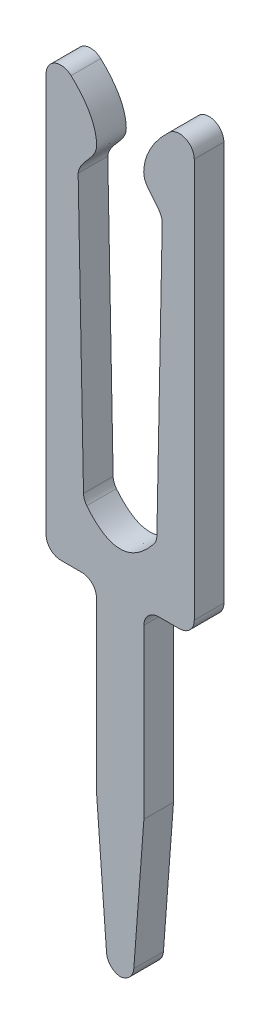
ISO-10303-21;
HEADER;
FILE_DESCRIPTION(('STEP AP214'),'2;1');
FILE_NAME('part.step','',(''),(''),'','','');
FILE_SCHEMA(('AUTOMOTIVE_DESIGN { 1 0 10303 214 1 1 1 1 }'));
ENDSEC;
DATA;
#1=APPLICATION_CONTEXT('core data for automotive mechanical design processes');
#2=APPLICATION_PROTOCOL_DEFINITION('international standard','automotive_design',2000,#1);
#3=PRODUCT_CONTEXT('',#1,'mechanical');
#4=PRODUCT('Part','Part','',(#3));
#5=PRODUCT_RELATED_PRODUCT_CATEGORY('part','',(#4));
#6=PRODUCT_DEFINITION_FORMATION('','',#4);
#7=PRODUCT_DEFINITION_CONTEXT('part definition',#1,'design');
#8=PRODUCT_DEFINITION('design','',#6,#7);
#9=PRODUCT_DEFINITION_SHAPE('','',#8);
#10=(LENGTH_UNIT() NAMED_UNIT(*) SI_UNIT(.MILLI.,.METRE.));
#11=(NAMED_UNIT(*) PLANE_ANGLE_UNIT() SI_UNIT($,.RADIAN.));
#12=(NAMED_UNIT(*) SI_UNIT($,.STERADIAN.) SOLID_ANGLE_UNIT());
#13=UNCERTAINTY_MEASURE_WITH_UNIT(LENGTH_MEASURE(1.E-05),#10,'distance_accuracy_value','');
#14=(GEOMETRIC_REPRESENTATION_CONTEXT(3) GLOBAL_UNCERTAINTY_ASSIGNED_CONTEXT((#13)) GLOBAL_UNIT_ASSIGNED_CONTEXT((#10,
#11,#12)) REPRESENTATION_CONTEXT('',''));
#15=CARTESIAN_POINT('',(0.,0.,0.));
#16=DIRECTION('',(0.,0.,1.));
#17=DIRECTION('',(1.,0.,0.));
#18=AXIS2_PLACEMENT_3D('',#15,#16,#17);
#19=CARTESIAN_POINT('',(0.0155617112013381,0.199393663752104,-0.2));
#20=DIRECTION('',(0.,0.,1.));
#21=DIRECTION('',(1.,0.,0.));
#22=AXIS2_PLACEMENT_3D('',#19,#20,#21);
#23=CYLINDRICAL_SURFACE('',#22,0.200000000000002);
#24=CARTESIAN_POINT('',(0.0155617112013381,0.199393663752104,0.2));
#25=DIRECTION('',(0.,0.,1.));
#26=DIRECTION('',(-1.,0.,0.));
#27=AXIS2_PLACEMENT_3D('',#24,#25,#26);
#28=CIRCLE('',#27,0.200000000000002);
#29=CARTESIAN_POINT('',(-0.183878150776376,0.184435674104075,0.2));
#30=VERTEX_POINT('',#29);
#31=CARTESIAN_POINT('',(0.,0.,0.2));
#32=VERTEX_POINT('',#31);
#33=EDGE_CURVE('E220',#30,#32,#28,.T.);
#34=ORIENTED_EDGE('',*,*,#33,.F.);
#35=DIRECTION('',(0.,0.,1.));
#36=VECTOR('',#35,1.);
#37=CARTESIAN_POINT('',(-0.183878150776376,0.184435674104075,-0.2));
#38=LINE('',#37,#36);
#39=CARTESIAN_POINT('',(-0.183878150776376,0.184435674104075,-0.2));
#40=VERTEX_POINT('',#39);
#41=EDGE_CURVE('E11',#40,#30,#38,.T.);
#42=ORIENTED_EDGE('',*,*,#41,.F.);
#43=CARTESIAN_POINT('',(0.0155617112013381,0.199393663752104,-0.2));
#44=DIRECTION('',(0.,0.,1.));
#45=DIRECTION('',(-1.,0.,0.));
#46=AXIS2_PLACEMENT_3D('',#43,#44,#45);
#47=CIRCLE('',#46,0.200000000000002);
#48=CARTESIAN_POINT('',(0.,0.,-0.2));
#49=VERTEX_POINT('',#48);
#50=EDGE_CURVE('E300',#40,#49,#47,.T.);
#51=ORIENTED_EDGE('',*,*,#50,.T.);
#52=DIRECTION('',(0.,0.,1.));
#53=VECTOR('',#52,1.);
#54=CARTESIAN_POINT('',(0.,0.,-0.2));
#55=LINE('',#54,#53);
#56=EDGE_CURVE('E36',#49,#32,#55,.T.);
#57=ORIENTED_EDGE('',*,*,#56,.T.);
#58=EDGE_LOOP('',(#34,#42,#51,#57));
#59=FACE_BOUND('',#58,.T.);
#60=ADVANCED_FACE('F33',(#59),#23,.T.);
#61=CARTESIAN_POINT('',(-0.183878150776376,0.184435674104075,-0.2));
#62=DIRECTION('',(-0.997199309888568,-0.0747899482401498,0.));
#63=DIRECTION('',(0.0747899482401498,-0.997199309888568,0.));
#64=AXIS2_PLACEMENT_3D('',#61,#62,#63);
#65=PLANE('',#64);
#66=DIRECTION('',(0.0747899482401498,-0.997199309888568,0.));
#67=VECTOR('',#66,1.);
#68=CARTESIAN_POINT('',(-0.183878150776376,0.184435674104075,0.2));
#69=LINE('',#68,#67);
#70=CARTESIAN_POINT('',(-0.319999999997295,1.99939366375255,0.2));
#71=VERTEX_POINT('',#70);
#72=EDGE_CURVE('E298',#71,#30,#69,.T.);
#73=ORIENTED_EDGE('',*,*,#72,.F.);
#74=DIRECTION('',(0.,0.,1.));
#75=VECTOR('',#74,1.);
#76=CARTESIAN_POINT('',(-0.319999999997295,1.99939366375255,-0.2));
#77=LINE('',#76,#75);
#78=CARTESIAN_POINT('',(-0.319999999997295,1.99939366375255,-0.2));
#79=VERTEX_POINT('',#78);
#80=EDGE_CURVE('E42',#79,#71,#77,.T.);
#81=ORIENTED_EDGE('',*,*,#80,.F.);
#82=DIRECTION('',(0.0747899482401498,-0.997199309888568,0.));
#83=VECTOR('',#82,1.);
#84=CARTESIAN_POINT('',(-0.183878150776376,0.184435674104075,-0.2));
#85=LINE('',#84,#83);
#86=EDGE_CURVE('E210',#79,#40,#85,.T.);
#87=ORIENTED_EDGE('',*,*,#86,.T.);
#88=ORIENTED_EDGE('',*,*,#41,.T.);
#89=EDGE_LOOP('',(#73,#81,#87,#88));
#90=FACE_BOUND('',#89,.T.);
#91=ADVANCED_FACE('F342',(#90),#65,.T.);
#92=CARTESIAN_POINT('',(-0.319999999997295,1.99939366375255,-0.2));
#93=DIRECTION('',(-1.,0.,0.));
#94=DIRECTION('',(0.,0.,1.));
#95=AXIS2_PLACEMENT_3D('',#92,#93,#94);
#96=PLANE('',#95);
#97=DIRECTION('',(0.,-1.,0.));
#98=VECTOR('',#97,1.);
#99=CARTESIAN_POINT('',(-0.319999999997295,1.99939366375255,0.2));
#100=LINE('',#99,#98);
#101=CARTESIAN_POINT('',(-0.319999999997295,4.26677514790499,0.2));
#102=VERTEX_POINT('',#101);
#103=EDGE_CURVE('E197',#102,#71,#100,.T.);
#104=ORIENTED_EDGE('',*,*,#103,.F.);
#105=DIRECTION('',(0.,0.,1.));
#106=VECTOR('',#105,1.);
#107=CARTESIAN_POINT('',(-0.319999999997295,4.26677514790499,-0.2));
#108=LINE('',#107,#106);
#109=CARTESIAN_POINT('',(-0.319999999997295,4.26677514790499,-0.2));
#110=VERTEX_POINT('',#109);
#111=EDGE_CURVE('E192',#110,#102,#108,.T.);
#112=ORIENTED_EDGE('',*,*,#111,.F.);
#113=DIRECTION('',(0.,-1.,0.));
#114=VECTOR('',#113,1.);
#115=CARTESIAN_POINT('',(-0.319999999997295,1.99939366375255,-0.2));
#116=LINE('',#115,#114);
#117=EDGE_CURVE('E195',#110,#79,#116,.T.);
#118=ORIENTED_EDGE('',*,*,#117,.T.);
#119=ORIENTED_EDGE('',*,*,#80,.T.);
#120=EDGE_LOOP('',(#104,#112,#118,#119));
#121=FACE_BOUND('',#120,.T.);
#122=ADVANCED_FACE('F194',(#121),#96,.T.);
#123=CARTESIAN_POINT('',(-0.519999999997274,4.26677514790499,-0.2));
#124=DIRECTION('',(0.,0.,1.));
#125=DIRECTION('',(1.,0.,0.));
#126=AXIS2_PLACEMENT_3D('',#123,#124,#125);
#127=CYLINDRICAL_SURFACE('',#126,0.199999999999987);
#128=CARTESIAN_POINT('',(-0.519999999997274,4.26677514790499,0.2));
#129=DIRECTION('',(0.,0.,-1.));
#130=DIRECTION('',(1.,0.,0.));
#131=AXIS2_PLACEMENT_3D('',#128,#129,#130);
#132=CIRCLE('',#131,0.199999999999987);
#133=CARTESIAN_POINT('',(-0.519999999997275,4.46677514790498,0.2));
#134=VERTEX_POINT('',#133);
#135=EDGE_CURVE('E295',#134,#102,#132,.T.);
#136=ORIENTED_EDGE('',*,*,#135,.F.);
#137=DIRECTION('',(0.,0.,1.));
#138=VECTOR('',#137,1.);
#139=CARTESIAN_POINT('',(-0.519999999997275,4.46677514790498,-0.2));
#140=LINE('',#139,#138);
#141=CARTESIAN_POINT('',(-0.519999999997275,4.46677514790498,-0.2));
#142=VERTEX_POINT('',#141);
#143=EDGE_CURVE('E202',#142,#134,#140,.T.);
#144=ORIENTED_EDGE('',*,*,#143,.F.);
#145=CARTESIAN_POINT('',(-0.519999999997274,4.26677514790499,-0.2));
#146=DIRECTION('',(0.,0.,-1.));
#147=DIRECTION('',(1.,0.,0.));
#148=AXIS2_PLACEMENT_3D('',#145,#146,#147);
#149=CIRCLE('',#148,0.199999999999987);
#150=EDGE_CURVE('E208',#142,#110,#149,.T.);
#151=ORIENTED_EDGE('',*,*,#150,.T.);
#152=ORIENTED_EDGE('',*,*,#111,.T.);
#153=EDGE_LOOP('',(#136,#144,#151,#152));
#154=FACE_BOUND('',#153,.T.);
#155=ADVANCED_FACE('F212',(#154),#127,.F.);
#156=CARTESIAN_POINT('',(-0.519999999997275,4.46677514790498,-0.2));
#157=DIRECTION('',(0.,-1.,0.));
#158=DIRECTION('',(1.,0.,0.));
#159=AXIS2_PLACEMENT_3D('',#156,#157,#158);
#160=PLANE('',#159);
#161=DIRECTION('',(1.,0.,0.));
#162=VECTOR('',#161,1.);
#163=CARTESIAN_POINT('',(-0.519999999997275,4.46677514790498,0.2));
#164=LINE('',#163,#162);
#165=CARTESIAN_POINT('',(-0.799999999997298,4.46677514790498,0.2));
#166=VERTEX_POINT('',#165);
#167=EDGE_CURVE('E292',#166,#134,#164,.T.);
#168=ORIENTED_EDGE('',*,*,#167,.F.);
#169=DIRECTION('',(0.,0.,1.));
#170=VECTOR('',#169,1.);
#171=CARTESIAN_POINT('',(-0.799999999997298,4.46677514790498,-0.2));
#172=LINE('',#171,#170);
#173=CARTESIAN_POINT('',(-0.799999999997298,4.46677514790498,-0.2));
#174=VERTEX_POINT('',#173);
#175=EDGE_CURVE('E304',#174,#166,#172,.T.);
#176=ORIENTED_EDGE('',*,*,#175,.F.);
#177=DIRECTION('',(1.,0.,0.));
#178=VECTOR('',#177,1.);
#179=CARTESIAN_POINT('',(-0.519999999997275,4.46677514790498,-0.2));
#180=LINE('',#179,#178);
#181=EDGE_CURVE('E213',#174,#142,#180,.T.);
#182=ORIENTED_EDGE('',*,*,#181,.T.);
#183=ORIENTED_EDGE('',*,*,#143,.T.);
#184=EDGE_LOOP('',(#168,#176,#182,#183));
#185=FACE_BOUND('',#184,.T.);
#186=ADVANCED_FACE('F355',(#185),#160,.T.);
#187=CARTESIAN_POINT('',(-0.799999999997298,4.66677514790498,-0.2));
#188=DIRECTION('',(0.,0.,1.));
#189=DIRECTION('',(1.,0.,0.));
#190=AXIS2_PLACEMENT_3D('',#187,#188,#189);
#191=CYLINDRICAL_SURFACE('',#190,0.199999999999995);
#192=CARTESIAN_POINT('',(-0.799999999997298,4.66677514790498,0.2));
#193=DIRECTION('',(0.,0.,1.));
#194=DIRECTION('',(-1.,0.,0.));
#195=AXIS2_PLACEMENT_3D('',#192,#193,#194);
#196=CIRCLE('',#195,0.199999999999995);
#197=CARTESIAN_POINT('',(-0.999999999997293,4.66677514790498,0.2));
#198=VERTEX_POINT('',#197);
#199=EDGE_CURVE('E289',#198,#166,#196,.T.);
#200=ORIENTED_EDGE('',*,*,#199,.F.);
#201=DIRECTION('',(0.,0.,1.));
#202=VECTOR('',#201,1.);
#203=CARTESIAN_POINT('',(-0.999999999997293,4.66677514790498,-0.2));
#204=LINE('',#203,#202);
#205=CARTESIAN_POINT('',(-0.999999999997293,4.66677514790498,-0.2));
#206=VERTEX_POINT('',#205);
#207=EDGE_CURVE('E306',#206,#198,#204,.T.);
#208=ORIENTED_EDGE('',*,*,#207,.F.);
#209=CARTESIAN_POINT('',(-0.799999999997298,4.66677514790498,-0.2));
#210=DIRECTION('',(0.,0.,1.));
#211=DIRECTION('',(-1.,0.,0.));
#212=AXIS2_PLACEMENT_3D('',#209,#210,#211);
#213=CIRCLE('',#212,0.199999999999995);
#214=EDGE_CURVE('E215',#206,#174,#213,.T.);
#215=ORIENTED_EDGE('',*,*,#214,.T.);
#216=ORIENTED_EDGE('',*,*,#175,.T.);
#217=EDGE_LOOP('',(#200,#208,#215,#216));
#218=FACE_BOUND('',#217,.T.);
#219=ADVANCED_FACE('F358',(#218),#191,.T.);
#220=CARTESIAN_POINT('',(-0.999999999997296,4.66677514790498,-0.2));
#221=DIRECTION('',(-1.,0.,0.));
#222=DIRECTION('',(0.,-1.,0.));
#223=AXIS2_PLACEMENT_3D('',#220,#221,#222);
#224=PLANE('',#223);
#225=DIRECTION('',(0.,-1.,0.));
#226=VECTOR('',#225,1.);
#227=CARTESIAN_POINT('',(-0.999999999997296,4.66677514790498,0.2));
#228=LINE('',#227,#226);
#229=CARTESIAN_POINT('',(-0.999999999997305,10.0571986848758,0.2));
#230=VERTEX_POINT('',#229);
#231=EDGE_CURVE('E286',#230,#198,#228,.T.);
#232=ORIENTED_EDGE('',*,*,#231,.F.);
#233=DIRECTION('',(0.,0.,1.));
#234=VECTOR('',#233,1.);
#235=CARTESIAN_POINT('',(-0.999999999997305,10.0571986848758,-0.2));
#236=LINE('',#235,#234);
#237=CARTESIAN_POINT('',(-0.999999999997305,10.0571986848758,-0.2));
#238=VERTEX_POINT('',#237);
#239=EDGE_CURVE('E308',#238,#230,#236,.T.);
#240=ORIENTED_EDGE('',*,*,#239,.F.);
#241=DIRECTION('',(0.,-1.,0.));
#242=VECTOR('',#241,1.);
#243=CARTESIAN_POINT('',(-0.999999999997296,4.66677514790498,-0.2));
#244=LINE('',#243,#242);
#245=EDGE_CURVE('E393',#238,#206,#244,.T.);
#246=ORIENTED_EDGE('',*,*,#245,.T.);
#247=ORIENTED_EDGE('',*,*,#207,.T.);
#248=EDGE_LOOP('',(#232,#240,#246,#247));
#249=FACE_BOUND('',#248,.T.);
#250=ADVANCED_FACE('F362',(#249),#224,.T.);
#251=CARTESIAN_POINT('',(-0.799999999997313,10.0571986848758,-0.2));
#252=DIRECTION('',(0.,0.,1.));
#253=DIRECTION('',(1.,0.,0.));
#254=AXIS2_PLACEMENT_3D('',#251,#252,#253);
#255=CYLINDRICAL_SURFACE('',#254,0.199999999999993);
#256=CARTESIAN_POINT('',(-0.799999999997313,10.0571986848758,0.2));
#257=DIRECTION('',(0.,0.,1.));
#258=DIRECTION('',(-1.,0.,0.));
#259=AXIS2_PLACEMENT_3D('',#256,#257,#258);
#260=CIRCLE('',#259,0.199999999999993);
#261=CARTESIAN_POINT('',(-0.663039519004165,10.2029444451782,0.2));
#262=VERTEX_POINT('',#261);
#263=EDGE_CURVE('E280',#262,#230,#260,.T.);
#264=ORIENTED_EDGE('',*,*,#263,.F.);
#265=DIRECTION('',(0.,0.,1.));
#266=VECTOR('',#265,1.);
#267=CARTESIAN_POINT('',(-0.663039519004165,10.2029444451782,-0.2));
#268=LINE('',#267,#266);
#269=CARTESIAN_POINT('',(-0.663039519004165,10.2029444451782,-0.2));
#270=VERTEX_POINT('',#269);
#271=EDGE_CURVE('E310',#270,#262,#268,.T.);
#272=ORIENTED_EDGE('',*,*,#271,.F.);
#273=CARTESIAN_POINT('',(-0.799999999997313,10.0571986848758,-0.2));
#274=DIRECTION('',(0.,0.,1.));
#275=DIRECTION('',(-1.,0.,0.));
#276=AXIS2_PLACEMENT_3D('',#273,#274,#275);
#277=CIRCLE('',#276,0.199999999999993);
#278=EDGE_CURVE('E385',#270,#238,#277,.T.);
#279=ORIENTED_EDGE('',*,*,#278,.T.);
#280=ORIENTED_EDGE('',*,*,#239,.T.);
#281=EDGE_LOOP('',(#264,#272,#279,#280));
#282=FACE_BOUND('',#281,.T.);
#283=ADVANCED_FACE('F366',(#282),#255,.T.);
#284=CARTESIAN_POINT('',(-0.567669207755578,9.10834496937554,-0.2));
#285=CARTESIAN_POINT('',(-0.54845388756171,9.27598469580027,-0.2));
#286=CARTESIAN_POINT('',(-0.310671132232239,9.38824738927317,-0.2));
#287=CARTESIAN_POINT('',(-0.326177603548474,9.81615503897428,-0.2));
#288=CARTESIAN_POINT('',(-0.487599251440383,10.0380793857477,-0.2));
#289=CARTESIAN_POINT('',(-0.663039519004166,10.2029444451782,-0.2));
#290=B_SPLINE_CURVE_WITH_KNOTS('',3,(#284,#285,#286,#287,#288,#289),.UNSPECIFIED.,.F.,.F.,(4,1,
1,4),(0.253308427317744,0.546240991694777,0.590136450844154,1.),.UNSPECIFIED.);
#291=DIRECTION('',(0.,0.,1.));
#292=VECTOR('',#291,1.);
#293=SURFACE_OF_LINEAR_EXTRUSION('',#290,#292);
#294=CARTESIAN_POINT('',(-0.567669207755578,9.10834496937554,0.2));
#295=CARTESIAN_POINT('',(-0.54845388756171,9.27598469580027,0.2));
#296=CARTESIAN_POINT('',(-0.310671132232239,9.38824738927317,0.2));
#297=CARTESIAN_POINT('',(-0.326177603548474,9.81615503897428,0.2));
#298=CARTESIAN_POINT('',(-0.487599251440383,10.0380793857477,0.2));
#299=CARTESIAN_POINT('',(-0.663039519004166,10.2029444451782,0.2));
#300=B_SPLINE_CURVE_WITH_KNOTS('',3,(#294,#295,#296,#297,#298,#299),.UNSPECIFIED.,.F.,.F.,(4,1,
1,4),(0.253308427317744,0.546240991694777,0.590136450844154,1.),.UNSPECIFIED.);
#301=CARTESIAN_POINT('',(-0.567669207755578,9.10834496937554,0.2));
#302=VERTEX_POINT('',#301);
#303=EDGE_CURVE('E275',#302,#262,#300,.T.);
#304=ORIENTED_EDGE('',*,*,#303,.F.);
#305=DIRECTION('',(0.,0.,1.));
#306=VECTOR('',#305,1.);
#307=CARTESIAN_POINT('',(-0.567669207755578,9.10834496937554,-0.2));
#308=LINE('',#307,#306);
#309=CARTESIAN_POINT('',(-0.567669207755578,9.10834496937554,-0.2));
#310=VERTEX_POINT('',#309);
#311=EDGE_CURVE('E312',#310,#302,#308,.T.);
#312=ORIENTED_EDGE('',*,*,#311,.F.);
#313=EDGE_CURVE('E378',#310,#270,#290,.T.);
#314=ORIENTED_EDGE('',*,*,#313,.T.);
#315=ORIENTED_EDGE('',*,*,#271,.T.);
#316=EDGE_LOOP('',(#304,#312,#314,#315));
#317=FACE_BOUND('',#316,.T.);
#318=ADVANCED_FACE('F370',(#317),#293,.T.);
#319=CARTESIAN_POINT('',(-0.567669207755587,9.10834496937554,-0.2));
#320=DIRECTION('',(0.999809016262246,0.0195430550508509,0.));
#321=DIRECTION('',(-0.0195430550508509,0.999809016262246,0.));
#322=AXIS2_PLACEMENT_3D('',#319,#320,#321);
#323=PLANE('',#322);
#324=DIRECTION('',(-0.0195430550508509,0.999809016262246,0.));
#325=VECTOR('',#324,1.);
#326=CARTESIAN_POINT('',(-0.567669207755587,9.10834496937554,0.2));
#327=LINE('',#326,#325);
#328=CARTESIAN_POINT('',(-0.495215905001466,5.40168471778945,0.2));
#329=VERTEX_POINT('',#328);
#330=EDGE_CURVE('E272',#329,#302,#327,.T.);
#331=ORIENTED_EDGE('',*,*,#330,.F.);
#332=DIRECTION('',(0.,0.,1.));
#333=VECTOR('',#332,1.);
#334=CARTESIAN_POINT('',(-0.495215905001466,5.40168471778945,-0.2));
#335=LINE('',#334,#333);
#336=CARTESIAN_POINT('',(-0.495215905001466,5.40168471778945,-0.2));
#337=VERTEX_POINT('',#336);
#338=EDGE_CURVE('E314',#337,#329,#335,.T.);
#339=ORIENTED_EDGE('',*,*,#338,.F.);
#340=DIRECTION('',(-0.0195430550508509,0.999809016262246,0.));
#341=VECTOR('',#340,1.);
#342=CARTESIAN_POINT('',(-0.567669207755587,9.10834496937554,-0.2));
#343=LINE('',#342,#341);
#344=EDGE_CURVE('E386',#337,#310,#343,.T.);
#345=ORIENTED_EDGE('',*,*,#344,.T.);
#346=ORIENTED_EDGE('',*,*,#311,.T.);
#347=EDGE_LOOP('',(#331,#339,#345,#346));
#348=FACE_BOUND('',#347,.T.);
#349=ADVANCED_FACE('F375',(#348),#323,.T.);
#350=CARTESIAN_POINT('',(-0.295254101749009,5.40559332879962,-0.2));
#351=DIRECTION('',(0.,0.,1.));
#352=DIRECTION('',(1.,0.,0.));
#353=AXIS2_PLACEMENT_3D('',#350,#351,#352);
#354=CYLINDRICAL_SURFACE('',#353,0.200000000000006);
#355=CARTESIAN_POINT('',(-0.295254101749009,5.40559332879962,0.2));
#356=DIRECTION('',(0.,0.,-1.));
#357=DIRECTION('',(1.,0.,0.));
#358=AXIS2_PLACEMENT_3D('',#355,#356,#357);
#359=CIRCLE('',#358,0.200000000000006);
#360=CARTESIAN_POINT('',(-0.451053838511064,5.28018821716187,0.2));
#361=VERTEX_POINT('',#360);
#362=EDGE_CURVE('E266',#361,#329,#359,.T.);
#363=ORIENTED_EDGE('',*,*,#362,.F.);
#364=DIRECTION('',(0.,0.,1.));
#365=VECTOR('',#364,1.);
#366=CARTESIAN_POINT('',(-0.451053838511064,5.28018821716187,-0.2));
#367=LINE('',#366,#365);
#368=CARTESIAN_POINT('',(-0.451053838511064,5.28018821716187,-0.2));
#369=VERTEX_POINT('',#368);
#370=EDGE_CURVE('E316',#369,#361,#367,.T.);
#371=ORIENTED_EDGE('',*,*,#370,.F.);
#372=CARTESIAN_POINT('',(-0.295254101749009,5.40559332879962,-0.2));
#373=DIRECTION('',(0.,0.,-1.));
#374=DIRECTION('',(1.,0.,0.));
#375=AXIS2_PLACEMENT_3D('',#372,#373,#374);
#376=CIRCLE('',#375,0.200000000000006);
#377=EDGE_CURVE('E411',#369,#337,#376,.T.);
#378=ORIENTED_EDGE('',*,*,#377,.T.);
#379=ORIENTED_EDGE('',*,*,#338,.T.);
#380=EDGE_LOOP('',(#363,#371,#378,#379));
#381=FACE_BOUND('',#380,.T.);
#382=ADVANCED_FACE('F430',(#381),#354,.F.);
#383=CARTESIAN_POINT('',(0.451053838511063,5.28018821716187,-0.2));
#384=CARTESIAN_POINT('',(0.,4.71981178283813,-0.2));
#385=CARTESIAN_POINT('',(-0.451053838511063,5.28018821716187,-0.2));
#386=B_SPLINE_CURVE_WITH_KNOTS('',2,(#383,#384,#385),.UNSPECIFIED.,.F.,.F.,(3,3),
(0.0434047342329982,0.956595265767001),.UNSPECIFIED.);
#387=DIRECTION('',(0.,0.,1.));
#388=VECTOR('',#387,1.);
#389=SURFACE_OF_LINEAR_EXTRUSION('',#386,#388);
#390=CARTESIAN_POINT('',(0.451053838511063,5.28018821716187,0.2));
#391=CARTESIAN_POINT('',(0.,4.71981178283813,0.2));
#392=CARTESIAN_POINT('',(-0.451053838511063,5.28018821716187,0.2));
#393=B_SPLINE_CURVE_WITH_KNOTS('',2,(#390,#391,#392),.UNSPECIFIED.,.F.,.F.,(3,3),
(0.0434047342329982,0.956595265767001),.UNSPECIFIED.);
#394=CARTESIAN_POINT('',(0.451053838511063,5.28018821716187,0.2));
#395=VERTEX_POINT('',#394);
#396=EDGE_CURVE('E261',#395,#361,#393,.T.);
#397=ORIENTED_EDGE('',*,*,#396,.F.);
#398=DIRECTION('',(0.,0.,1.));
#399=VECTOR('',#398,1.);
#400=CARTESIAN_POINT('',(0.451053838511063,5.28018821716187,-0.2));
#401=LINE('',#400,#399);
#402=CARTESIAN_POINT('',(0.451053838511063,5.28018821716187,-0.2));
#403=VERTEX_POINT('',#402);
#404=EDGE_CURVE('E318',#403,#395,#401,.T.);
#405=ORIENTED_EDGE('',*,*,#404,.F.);
#406=EDGE_CURVE('E412',#403,#369,#386,.T.);
#407=ORIENTED_EDGE('',*,*,#406,.T.);
#408=ORIENTED_EDGE('',*,*,#370,.T.);
#409=EDGE_LOOP('',(#397,#405,#407,#408));
#410=FACE_BOUND('',#409,.T.);
#411=ADVANCED_FACE('F426',(#410),#389,.T.);
#412=CARTESIAN_POINT('',(0.29525410174901,5.40559332879962,-0.2));
#413=DIRECTION('',(0.,0.,1.));
#414=DIRECTION('',(1.,0.,0.));
#415=AXIS2_PLACEMENT_3D('',#412,#413,#414);
#416=CYLINDRICAL_SURFACE('',#415,0.200000000000008);
#417=CARTESIAN_POINT('',(0.29525410174901,5.40559332879962,0.2));
#418=DIRECTION('',(0.,0.,-1.));
#419=DIRECTION('',(-1.,0.,0.));
#420=AXIS2_PLACEMENT_3D('',#417,#418,#419);
#421=CIRCLE('',#420,0.200000000000008);
#422=CARTESIAN_POINT('',(0.495215905001467,5.40168471778945,0.2));
#423=VERTEX_POINT('',#422);
#424=EDGE_CURVE('E258',#423,#395,#421,.T.);
#425=ORIENTED_EDGE('',*,*,#424,.F.);
#426=DIRECTION('',(0.,0.,1.));
#427=VECTOR('',#426,1.);
#428=CARTESIAN_POINT('',(0.495215905001467,5.40168471778945,-0.2));
#429=LINE('',#428,#427);
#430=CARTESIAN_POINT('',(0.495215905001467,5.40168471778945,-0.2));
#431=VERTEX_POINT('',#430);
#432=EDGE_CURVE('E320',#431,#423,#429,.T.);
#433=ORIENTED_EDGE('',*,*,#432,.F.);
#434=CARTESIAN_POINT('',(0.29525410174901,5.40559332879962,-0.2));
#435=DIRECTION('',(0.,0.,-1.));
#436=DIRECTION('',(-1.,0.,0.));
#437=AXIS2_PLACEMENT_3D('',#434,#435,#436);
#438=CIRCLE('',#437,0.200000000000008);
#439=EDGE_CURVE('E415',#431,#403,#438,.T.);
#440=ORIENTED_EDGE('',*,*,#439,.T.);
#441=ORIENTED_EDGE('',*,*,#404,.T.);
#442=EDGE_LOOP('',(#425,#433,#440,#441));
#443=FACE_BOUND('',#442,.T.);
#444=ADVANCED_FACE('F429',(#443),#416,.F.);
#445=CARTESIAN_POINT('',(0.567669207755587,9.10834496937554,-0.2));
#446=DIRECTION('',(-0.999809016262246,0.0195430550508509,0.));
#447=DIRECTION('',(-0.0195430550508509,-0.999809016262246,0.));
#448=AXIS2_PLACEMENT_3D('',#445,#446,#447);
#449=PLANE('',#448);
#450=DIRECTION('',(-0.0195430550508509,-0.999809016262246,0.));
#451=VECTOR('',#450,1.);
#452=CARTESIAN_POINT('',(0.567669207755587,9.10834496937554,0.2));
#453=LINE('',#452,#451);
#454=CARTESIAN_POINT('',(0.567669207755587,9.10834496937554,0.2));
#455=VERTEX_POINT('',#454);
#456=EDGE_CURVE('E252',#455,#423,#453,.T.);
#457=ORIENTED_EDGE('',*,*,#456,.F.);
#458=DIRECTION('',(0.,0.,1.));
#459=VECTOR('',#458,1.);
#460=CARTESIAN_POINT('',(0.567669207755587,9.10834496937554,-0.2));
#461=LINE('',#460,#459);
#462=CARTESIAN_POINT('',(0.567669207755587,9.10834496937554,-0.2));
#463=VERTEX_POINT('',#462);
#464=EDGE_CURVE('E322',#463,#455,#461,.T.);
#465=ORIENTED_EDGE('',*,*,#464,.F.);
#466=DIRECTION('',(-0.0195430550508509,-0.999809016262246,0.));
#467=VECTOR('',#466,1.);
#468=CARTESIAN_POINT('',(0.567669207755587,9.10834496937554,-0.2));
#469=LINE('',#468,#467);
#470=EDGE_CURVE('E452',#463,#431,#469,.T.);
#471=ORIENTED_EDGE('',*,*,#470,.T.);
#472=ORIENTED_EDGE('',*,*,#432,.T.);
#473=EDGE_LOOP('',(#457,#465,#471,#472));
#474=FACE_BOUND('',#473,.T.);
#475=ADVANCED_FACE('F434',(#474),#449,.T.);
#476=CARTESIAN_POINT('',(0.663039519004165,10.2029444451782,-0.2));
#477=CARTESIAN_POINT('',(0.487599251440382,10.0380793857477,-0.2));
#478=CARTESIAN_POINT('',(0.326177603548474,9.81615503897428,-0.2));
#479=CARTESIAN_POINT('',(0.31067113223224,9.38824738927318,-0.2));
#480=CARTESIAN_POINT('',(0.548453887561711,9.27598469580027,-0.2));
#481=CARTESIAN_POINT('',(0.567669207755578,9.10834496937554,-0.2));
#482=B_SPLINE_CURVE_WITH_KNOTS('',3,(#476,#477,#478,#479,#480,#481),.UNSPECIFIED.,.F.,.F.,(4,1,
1,4),(0.253308427317744,0.66317197647359,0.707067435622967,1.),.UNSPECIFIED.);
#483=DIRECTION('',(0.,0.,1.));
#484=VECTOR('',#483,1.);
#485=SURFACE_OF_LINEAR_EXTRUSION('',#482,#484);
#486=CARTESIAN_POINT('',(0.663039519004165,10.2029444451782,0.2));
#487=CARTESIAN_POINT('',(0.487599251440382,10.0380793857477,0.2));
#488=CARTESIAN_POINT('',(0.326177603548474,9.81615503897428,0.2));
#489=CARTESIAN_POINT('',(0.31067113223224,9.38824738927318,0.2));
#490=CARTESIAN_POINT('',(0.548453887561711,9.27598469580027,0.2));
#491=CARTESIAN_POINT('',(0.567669207755578,9.10834496937554,0.2));
#492=B_SPLINE_CURVE_WITH_KNOTS('',3,(#486,#487,#488,#489,#490,#491),.UNSPECIFIED.,.F.,.F.,(4,1,
1,4),(0.253308427317744,0.66317197647359,0.707067435622967,1.),.UNSPECIFIED.);
#493=CARTESIAN_POINT('',(0.663039519004165,10.2029444451782,0.2));
#494=VERTEX_POINT('',#493);
#495=EDGE_CURVE('E247',#494,#455,#492,.T.);
#496=ORIENTED_EDGE('',*,*,#495,.F.);
#497=DIRECTION('',(0.,0.,1.));
#498=VECTOR('',#497,1.);
#499=CARTESIAN_POINT('',(0.663039519004165,10.2029444451782,-0.2));
#500=LINE('',#499,#498);
#501=CARTESIAN_POINT('',(0.663039519004165,10.2029444451782,-0.2));
#502=VERTEX_POINT('',#501);
#503=EDGE_CURVE('E324',#502,#494,#500,.T.);
#504=ORIENTED_EDGE('',*,*,#503,.F.);
#505=EDGE_CURVE('E446',#502,#463,#482,.T.);
#506=ORIENTED_EDGE('',*,*,#505,.T.);
#507=ORIENTED_EDGE('',*,*,#464,.T.);
#508=EDGE_LOOP('',(#496,#504,#506,#507));
#509=FACE_BOUND('',#508,.T.);
#510=ADVANCED_FACE('F438',(#509),#485,.T.);
#511=CARTESIAN_POINT('',(0.799999999997314,10.0571986848758,-0.2));
#512=DIRECTION('',(0.,0.,1.));
#513=DIRECTION('',(1.,0.,0.));
#514=AXIS2_PLACEMENT_3D('',#511,#512,#513);
#515=CYLINDRICAL_SURFACE('',#514,0.199999999999993);
#516=CARTESIAN_POINT('',(0.799999999997314,10.0571986848758,0.2));
#517=DIRECTION('',(0.,0.,1.));
#518=DIRECTION('',(1.,0.,0.));
#519=AXIS2_PLACEMENT_3D('',#516,#517,#518);
#520=CIRCLE('',#519,0.199999999999993);
#521=CARTESIAN_POINT('',(0.999999999997306,10.0571986848758,0.2));
#522=VERTEX_POINT('',#521);
#523=EDGE_CURVE('E244',#522,#494,#520,.T.);
#524=ORIENTED_EDGE('',*,*,#523,.F.);
#525=DIRECTION('',(0.,0.,1.));
#526=VECTOR('',#525,1.);
#527=CARTESIAN_POINT('',(0.999999999997306,10.0571986848758,-0.2));
#528=LINE('',#527,#526);
#529=CARTESIAN_POINT('',(0.999999999997306,10.0571986848758,-0.2));
#530=VERTEX_POINT('',#529);
#531=EDGE_CURVE('E326',#530,#522,#528,.T.);
#532=ORIENTED_EDGE('',*,*,#531,.F.);
#533=CARTESIAN_POINT('',(0.799999999997314,10.0571986848758,-0.2));
#534=DIRECTION('',(0.,0.,1.));
#535=DIRECTION('',(1.,0.,0.));
#536=AXIS2_PLACEMENT_3D('',#533,#534,#535);
#537=CIRCLE('',#536,0.199999999999993);
#538=EDGE_CURVE('E453',#530,#502,#537,.T.);
#539=ORIENTED_EDGE('',*,*,#538,.T.);
#540=ORIENTED_EDGE('',*,*,#503,.T.);
#541=EDGE_LOOP('',(#524,#532,#539,#540));
#542=FACE_BOUND('',#541,.T.);
#543=ADVANCED_FACE('F443',(#542),#515,.T.);
#544=CARTESIAN_POINT('',(0.999999999997298,4.66677514790498,-0.2));
#545=DIRECTION('',(1.,0.,0.));
#546=DIRECTION('',(0.,1.,0.));
#547=AXIS2_PLACEMENT_3D('',#544,#545,#546);
#548=PLANE('',#547);
#549=DIRECTION('',(0.,1.,0.));
#550=VECTOR('',#549,1.);
#551=CARTESIAN_POINT('',(0.999999999997298,4.66677514790498,0.2));
#552=LINE('',#551,#550);
#553=CARTESIAN_POINT('',(0.999999999997298,4.66677514790498,0.2));
#554=VERTEX_POINT('',#553);
#555=EDGE_CURVE('E241',#554,#522,#552,.T.);
#556=ORIENTED_EDGE('',*,*,#555,.F.);
#557=DIRECTION('',(0.,0.,1.));
#558=VECTOR('',#557,1.);
#559=CARTESIAN_POINT('',(0.999999999997298,4.66677514790498,-0.2));
#560=LINE('',#559,#558);
#561=CARTESIAN_POINT('',(0.999999999997298,4.66677514790498,-0.2));
#562=VERTEX_POINT('',#561);
#563=EDGE_CURVE('E328',#562,#554,#560,.T.);
#564=ORIENTED_EDGE('',*,*,#563,.F.);
#565=DIRECTION('',(0.,1.,0.));
#566=VECTOR('',#565,1.);
#567=CARTESIAN_POINT('',(0.999999999997298,4.66677514790498,-0.2));
#568=LINE('',#567,#566);
#569=EDGE_CURVE('E475',#562,#530,#568,.T.);
#570=ORIENTED_EDGE('',*,*,#569,.T.);
#571=ORIENTED_EDGE('',*,*,#531,.T.);
#572=EDGE_LOOP('',(#556,#564,#570,#571));
#573=FACE_BOUND('',#572,.T.);
#574=ADVANCED_FACE('F515',(#573),#548,.T.);
#575=CARTESIAN_POINT('',(0.799999999997299,4.66677514790498,-0.2));
#576=DIRECTION('',(0.,0.,1.));
#577=DIRECTION('',(1.,0.,0.));
#578=AXIS2_PLACEMENT_3D('',#575,#576,#577);
#579=CYLINDRICAL_SURFACE('',#578,0.199999999999995);
#580=CARTESIAN_POINT('',(0.799999999997299,4.66677514790498,0.2));
#581=DIRECTION('',(0.,0.,1.));
#582=DIRECTION('',(1.,0.,0.));
#583=AXIS2_PLACEMENT_3D('',#580,#581,#582);
#584=CIRCLE('',#583,0.199999999999995);
#585=CARTESIAN_POINT('',(0.799999999997299,4.46677514790498,0.2));
#586=VERTEX_POINT('',#585);
#587=EDGE_CURVE('E238',#586,#554,#584,.T.);
#588=ORIENTED_EDGE('',*,*,#587,.F.);
#589=DIRECTION('',(0.,0.,1.));
#590=VECTOR('',#589,1.);
#591=CARTESIAN_POINT('',(0.799999999997299,4.46677514790498,-0.2));
#592=LINE('',#591,#590);
#593=CARTESIAN_POINT('',(0.799999999997299,4.46677514790498,-0.2));
#594=VERTEX_POINT('',#593);
#595=EDGE_CURVE('E330',#594,#586,#592,.T.);
#596=ORIENTED_EDGE('',*,*,#595,.F.);
#597=CARTESIAN_POINT('',(0.799999999997299,4.66677514790498,-0.2));
#598=DIRECTION('',(0.,0.,1.));
#599=DIRECTION('',(1.,0.,0.));
#600=AXIS2_PLACEMENT_3D('',#597,#598,#599);
#601=CIRCLE('',#600,0.199999999999995);
#602=EDGE_CURVE('E476',#594,#562,#601,.T.);
#603=ORIENTED_EDGE('',*,*,#602,.T.);
#604=ORIENTED_EDGE('',*,*,#563,.T.);
#605=EDGE_LOOP('',(#588,#596,#603,#604));
#606=FACE_BOUND('',#605,.T.);
#607=ADVANCED_FACE('F513',(#606),#579,.T.);
#608=CARTESIAN_POINT('',(0.519999999997276,4.46677514790498,-0.2));
#609=DIRECTION('',(0.,-1.,0.));
#610=DIRECTION('',(1.,0.,0.));
#611=AXIS2_PLACEMENT_3D('',#608,#609,#610);
#612=PLANE('',#611);
#613=DIRECTION('',(1.,0.,0.));
#614=VECTOR('',#613,1.);
#615=CARTESIAN_POINT('',(0.519999999997276,4.46677514790498,0.2));
#616=LINE('',#615,#614);
#617=CARTESIAN_POINT('',(0.519999999997276,4.46677514790498,0.2));
#618=VERTEX_POINT('',#617);
#619=EDGE_CURVE('E235',#618,#586,#616,.T.);
#620=ORIENTED_EDGE('',*,*,#619,.F.);
#621=DIRECTION('',(0.,0.,1.));
#622=VECTOR('',#621,1.);
#623=CARTESIAN_POINT('',(0.519999999997276,4.46677514790498,-0.2));
#624=LINE('',#623,#622);
#625=CARTESIAN_POINT('',(0.519999999997276,4.46677514790498,-0.2));
#626=VERTEX_POINT('',#625);
#627=EDGE_CURVE('E332',#626,#618,#624,.T.);
#628=ORIENTED_EDGE('',*,*,#627,.F.);
#629=DIRECTION('',(1.,0.,0.));
#630=VECTOR('',#629,1.);
#631=CARTESIAN_POINT('',(0.519999999997276,4.46677514790498,-0.2));
#632=LINE('',#631,#630);
#633=EDGE_CURVE('E479',#626,#594,#632,.T.);
#634=ORIENTED_EDGE('',*,*,#633,.T.);
#635=ORIENTED_EDGE('',*,*,#595,.T.);
#636=EDGE_LOOP('',(#620,#628,#634,#635));
#637=FACE_BOUND('',#636,.T.);
#638=ADVANCED_FACE('F509',(#637),#612,.T.);
#639=CARTESIAN_POINT('',(0.519999999997276,4.26677514790499,-0.2));
#640=DIRECTION('',(0.,0.,1.));
#641=DIRECTION('',(1.,0.,0.));
#642=AXIS2_PLACEMENT_3D('',#639,#640,#641);
#643=CYLINDRICAL_SURFACE('',#642,0.199999999999987);
#644=CARTESIAN_POINT('',(0.519999999997276,4.26677514790499,0.2));
#645=DIRECTION('',(0.,0.,-1.));
#646=DIRECTION('',(-1.,0.,0.));
#647=AXIS2_PLACEMENT_3D('',#644,#645,#646);
#648=CIRCLE('',#647,0.199999999999987);
#649=CARTESIAN_POINT('',(0.319999999997289,4.26677514790499,0.2));
#650=VERTEX_POINT('',#649);
#651=EDGE_CURVE('E232',#650,#618,#648,.T.);
#652=ORIENTED_EDGE('',*,*,#651,.F.);
#653=DIRECTION('',(0.,0.,1.));
#654=VECTOR('',#653,1.);
#655=CARTESIAN_POINT('',(0.319999999997289,4.26677514790499,-0.2));
#656=LINE('',#655,#654);
#657=CARTESIAN_POINT('',(0.319999999997289,4.26677514790499,-0.2));
#658=VERTEX_POINT('',#657);
#659=EDGE_CURVE('E334',#658,#650,#656,.T.);
#660=ORIENTED_EDGE('',*,*,#659,.F.);
#661=CARTESIAN_POINT('',(0.519999999997276,4.26677514790499,-0.2));
#662=DIRECTION('',(0.,0.,-1.));
#663=DIRECTION('',(-1.,0.,0.));
#664=AXIS2_PLACEMENT_3D('',#661,#662,#663);
#665=CIRCLE('',#664,0.199999999999987);
#666=EDGE_CURVE('E484',#658,#626,#665,.T.);
#667=ORIENTED_EDGE('',*,*,#666,.T.);
#668=ORIENTED_EDGE('',*,*,#627,.T.);
#669=EDGE_LOOP('',(#652,#660,#667,#668));
#670=FACE_BOUND('',#669,.T.);
#671=ADVANCED_FACE('F505',(#670),#643,.F.);
#672=CARTESIAN_POINT('',(0.319999999997281,1.99939366375255,-0.2));
#673=DIRECTION('',(1.,0.,0.));
#674=DIRECTION('',(0.,1.,0.));
#675=AXIS2_PLACEMENT_3D('',#672,#673,#674);
#676=PLANE('',#675);
#677=DIRECTION('',(0.,1.,0.));
#678=VECTOR('',#677,1.);
#679=CARTESIAN_POINT('',(0.319999999997281,1.99939366375255,0.2));
#680=LINE('',#679,#678);
#681=CARTESIAN_POINT('',(0.319999999997281,1.99939366375255,0.2));
#682=VERTEX_POINT('',#681);
#683=EDGE_CURVE('E229',#682,#650,#680,.T.);
#684=ORIENTED_EDGE('',*,*,#683,.F.);
#685=DIRECTION('',(0.,0.,1.));
#686=VECTOR('',#685,1.);
#687=CARTESIAN_POINT('',(0.319999999997281,1.99939366375255,-0.2));
#688=LINE('',#687,#686);
#689=CARTESIAN_POINT('',(0.319999999997281,1.99939366375255,-0.2));
#690=VERTEX_POINT('',#689);
#691=EDGE_CURVE('E336',#690,#682,#688,.T.);
#692=ORIENTED_EDGE('',*,*,#691,.F.);
#693=DIRECTION('',(0.,1.,0.));
#694=VECTOR('',#693,1.);
#695=CARTESIAN_POINT('',(0.319999999997281,1.99939366375255,-0.2));
#696=LINE('',#695,#694);
#697=EDGE_CURVE('E487',#690,#658,#696,.T.);
#698=ORIENTED_EDGE('',*,*,#697,.T.);
#699=ORIENTED_EDGE('',*,*,#659,.T.);
#700=EDGE_LOOP('',(#684,#692,#698,#699));
#701=FACE_BOUND('',#700,.T.);
#702=ADVANCED_FACE('F503',(#701),#676,.T.);
#703=CARTESIAN_POINT('',(0.183878150776376,0.184435674104075,-0.2));
#704=DIRECTION('',(0.997199309888568,-0.0747899482401422,0.));
#705=DIRECTION('',(0.0747899482401422,0.997199309888568,0.));
#706=AXIS2_PLACEMENT_3D('',#703,#704,#705);
#707=PLANE('',#706);
#708=DIRECTION('',(0.0747899482401422,0.997199309888568,0.));
#709=VECTOR('',#708,1.);
#710=CARTESIAN_POINT('',(0.183878150776376,0.184435674104075,0.2));
#711=LINE('',#710,#709);
#712=CARTESIAN_POINT('',(0.183878150776376,0.184435674104075,0.2));
#713=VERTEX_POINT('',#712);
#714=EDGE_CURVE('E226',#713,#682,#711,.T.);
#715=ORIENTED_EDGE('',*,*,#714,.F.);
#716=DIRECTION('',(0.,0.,1.));
#717=VECTOR('',#716,1.);
#718=CARTESIAN_POINT('',(0.183878150776376,0.184435674104075,-0.2));
#719=LINE('',#718,#717);
#720=CARTESIAN_POINT('',(0.183878150776376,0.184435674104075,-0.2));
#721=VERTEX_POINT('',#720);
#722=EDGE_CURVE('E337',#721,#713,#719,.T.);
#723=ORIENTED_EDGE('',*,*,#722,.F.);
#724=DIRECTION('',(0.0747899482401422,0.997199309888568,0.));
#725=VECTOR('',#724,1.);
#726=CARTESIAN_POINT('',(0.183878150776376,0.184435674104075,-0.2));
#727=LINE('',#726,#725);
#728=EDGE_CURVE('E490',#721,#690,#727,.T.);
#729=ORIENTED_EDGE('',*,*,#728,.T.);
#730=ORIENTED_EDGE('',*,*,#691,.T.);
#731=EDGE_LOOP('',(#715,#723,#729,#730));
#732=FACE_BOUND('',#731,.T.);
#733=ADVANCED_FACE('F499',(#732),#707,.T.);
#734=CARTESIAN_POINT('',(-0.0155617112013381,0.199393663752104,-0.2));
#735=DIRECTION('',(0.,0.,1.));
#736=DIRECTION('',(1.,0.,0.));
#737=AXIS2_PLACEMENT_3D('',#734,#735,#736);
#738=CYLINDRICAL_SURFACE('',#737,0.200000000000002);
#739=CARTESIAN_POINT('',(-0.0155617112013381,0.199393663752104,0.2));
#740=DIRECTION('',(0.,0.,1.));
#741=DIRECTION('',(1.,0.,0.));
#742=AXIS2_PLACEMENT_3D('',#739,#740,#741);
#743=CIRCLE('',#742,0.200000000000002);
#744=EDGE_CURVE('E223',#32,#713,#743,.T.);
#745=ORIENTED_EDGE('',*,*,#744,.F.);
#746=ORIENTED_EDGE('',*,*,#56,.F.);
#747=CARTESIAN_POINT('',(-0.0155617112013381,0.199393663752104,-0.2));
#748=DIRECTION('',(0.,0.,1.));
#749=DIRECTION('',(1.,0.,0.));
#750=AXIS2_PLACEMENT_3D('',#747,#748,#749);
#751=CIRCLE('',#750,0.200000000000002);
#752=EDGE_CURVE('E493',#49,#721,#751,.T.);
#753=ORIENTED_EDGE('',*,*,#752,.T.);
#754=ORIENTED_EDGE('',*,*,#722,.T.);
#755=EDGE_LOOP('',(#745,#746,#753,#754));
#756=FACE_BOUND('',#755,.T.);
#757=ADVANCED_FACE('F339',(#756),#738,.T.);
#758=CARTESIAN_POINT('',(0.0155617112013381,0.199393663752104,-0.2));
#759=DIRECTION('',(0.,0.,-1.));
#760=DIRECTION('',(-1.,0.,0.));
#761=AXIS2_PLACEMENT_3D('',#758,#759,#760);
#762=PLANE('',#761);
#763=ORIENTED_EDGE('',*,*,#50,.F.);
#764=ORIENTED_EDGE('',*,*,#86,.F.);
#765=ORIENTED_EDGE('',*,*,#117,.F.);
#766=ORIENTED_EDGE('',*,*,#150,.F.);
#767=ORIENTED_EDGE('',*,*,#181,.F.);
#768=ORIENTED_EDGE('',*,*,#214,.F.);
#769=ORIENTED_EDGE('',*,*,#245,.F.);
#770=ORIENTED_EDGE('',*,*,#278,.F.);
#771=ORIENTED_EDGE('',*,*,#313,.F.);
#772=ORIENTED_EDGE('',*,*,#344,.F.);
#773=ORIENTED_EDGE('',*,*,#377,.F.);
#774=ORIENTED_EDGE('',*,*,#406,.F.);
#775=ORIENTED_EDGE('',*,*,#439,.F.);
#776=ORIENTED_EDGE('',*,*,#470,.F.);
#777=ORIENTED_EDGE('',*,*,#505,.F.);
#778=ORIENTED_EDGE('',*,*,#538,.F.);
#779=ORIENTED_EDGE('',*,*,#569,.F.);
#780=ORIENTED_EDGE('',*,*,#602,.F.);
#781=ORIENTED_EDGE('',*,*,#633,.F.);
#782=ORIENTED_EDGE('',*,*,#666,.F.);
#783=ORIENTED_EDGE('',*,*,#697,.F.);
#784=ORIENTED_EDGE('',*,*,#728,.F.);
#785=ORIENTED_EDGE('',*,*,#752,.F.);
#786=EDGE_LOOP('',(#763,#764,#765,#766,#767,#768,#769,#770,#771,#772,#773,#774,#775,#776,#777,
#778,#779,#780,#781,#782,#783,#784,#785));
#787=FACE_BOUND('',#786,.T.);
#788=ADVANCED_FACE('F206',(#787),#762,.T.);
#789=CARTESIAN_POINT('',(0.0155617112013381,0.199393663752104,0.2));
#790=DIRECTION('',(0.,0.,-1.));
#791=DIRECTION('',(-1.,0.,0.));
#792=AXIS2_PLACEMENT_3D('',#789,#790,#791);
#793=PLANE('',#792);
#794=ORIENTED_EDGE('',*,*,#33,.T.);
#795=ORIENTED_EDGE('',*,*,#744,.T.);
#796=ORIENTED_EDGE('',*,*,#714,.T.);
#797=ORIENTED_EDGE('',*,*,#683,.T.);
#798=ORIENTED_EDGE('',*,*,#651,.T.);
#799=ORIENTED_EDGE('',*,*,#619,.T.);
#800=ORIENTED_EDGE('',*,*,#587,.T.);
#801=ORIENTED_EDGE('',*,*,#555,.T.);
#802=ORIENTED_EDGE('',*,*,#523,.T.);
#803=ORIENTED_EDGE('',*,*,#495,.T.);
#804=ORIENTED_EDGE('',*,*,#456,.T.);
#805=ORIENTED_EDGE('',*,*,#424,.T.);
#806=ORIENTED_EDGE('',*,*,#396,.T.);
#807=ORIENTED_EDGE('',*,*,#362,.T.);
#808=ORIENTED_EDGE('',*,*,#330,.T.);
#809=ORIENTED_EDGE('',*,*,#303,.T.);
#810=ORIENTED_EDGE('',*,*,#263,.T.);
#811=ORIENTED_EDGE('',*,*,#231,.T.);
#812=ORIENTED_EDGE('',*,*,#199,.T.);
#813=ORIENTED_EDGE('',*,*,#167,.T.);
#814=ORIENTED_EDGE('',*,*,#135,.T.);
#815=ORIENTED_EDGE('',*,*,#103,.T.);
#816=ORIENTED_EDGE('',*,*,#72,.T.);
#817=EDGE_LOOP('',(#794,#795,#796,#797,#798,#799,#800,#801,#802,#803,#804,#805,#806,#807,#808,
#809,#810,#811,#812,#813,#814,#815,#816));
#818=FACE_BOUND('',#817,.T.);
#819=ADVANCED_FACE('F341',(#818),#793,.F.);
#820=CLOSED_SHELL('',(#60,#91,#122,#155,#186,#219,#250,#283,#318,#349,#382,#411,#444,#475,#510,
#543,#574,#607,#638,#671,#702,#733,#757,#788,#819));
#821=MANIFOLD_SOLID_BREP('B2',#820);
#822=ADVANCED_BREP_SHAPE_REPRESENTATION('',(#18,#821),#14);
#823=SHAPE_DEFINITION_REPRESENTATION(#9,#822);
ENDSEC;
END-ISO-10303-21;
